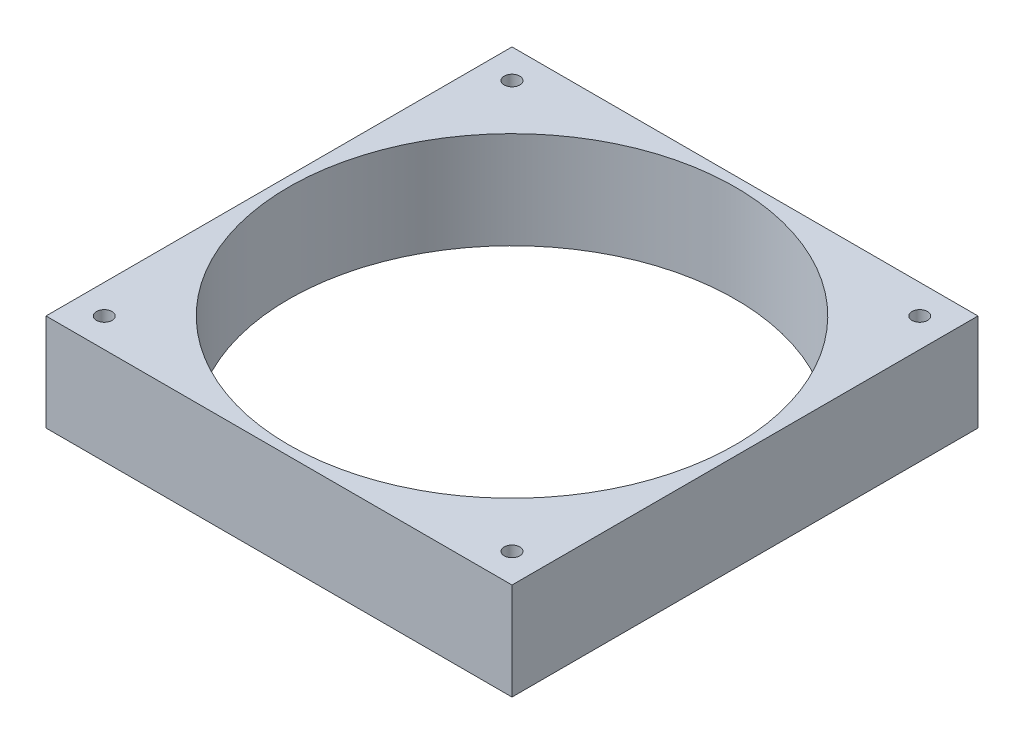
ISO-10303-21;
HEADER;
FILE_DESCRIPTION(('STEP AP214'),'2;1');
FILE_NAME('part.step','',(''),(''),'','','');
FILE_SCHEMA(('AUTOMOTIVE_DESIGN { 1 0 10303 214 1 1 1 1 }'));
ENDSEC;
DATA;
#1=APPLICATION_CONTEXT('core data for automotive mechanical design processes');
#2=APPLICATION_PROTOCOL_DEFINITION('international standard','automotive_design',2000,#1);
#3=PRODUCT_CONTEXT('',#1,'mechanical');
#4=PRODUCT('Part','Part','',(#3));
#5=PRODUCT_RELATED_PRODUCT_CATEGORY('part','',(#4));
#6=PRODUCT_DEFINITION_FORMATION('','',#4);
#7=PRODUCT_DEFINITION_CONTEXT('part definition',#1,'design');
#8=PRODUCT_DEFINITION('design','',#6,#7);
#9=PRODUCT_DEFINITION_SHAPE('','',#8);
#10=(LENGTH_UNIT() NAMED_UNIT(*) SI_UNIT(.MILLI.,.METRE.));
#11=(NAMED_UNIT(*) PLANE_ANGLE_UNIT() SI_UNIT($,.RADIAN.));
#12=(NAMED_UNIT(*) SI_UNIT($,.STERADIAN.) SOLID_ANGLE_UNIT());
#13=UNCERTAINTY_MEASURE_WITH_UNIT(LENGTH_MEASURE(1.E-05),#10,'distance_accuracy_value','');
#14=(GEOMETRIC_REPRESENTATION_CONTEXT(3) GLOBAL_UNCERTAINTY_ASSIGNED_CONTEXT((#13)) GLOBAL_UNIT_ASSIGNED_CONTEXT((#10,
#11,#12)) REPRESENTATION_CONTEXT('',''));
#15=CARTESIAN_POINT('',(0.,0.,0.));
#16=DIRECTION('',(0.,0.,1.));
#17=DIRECTION('',(1.,0.,0.));
#18=AXIS2_PLACEMENT_3D('',#15,#16,#17);
#19=CARTESIAN_POINT('',(0.,25.,0.));
#20=DIRECTION('',(1.,0.,0.));
#21=DIRECTION('',(0.,0.,-1.));
#22=AXIS2_PLACEMENT_3D('',#19,#20,#21);
#23=PLANE('',#22);
#24=DIRECTION('',(0.,0.,1.));
#25=VECTOR('',#24,1.);
#26=CARTESIAN_POINT('',(0.,0.,0.));
#27=LINE('',#26,#25);
#28=CARTESIAN_POINT('',(0.,0.,0.));
#29=VERTEX_POINT('',#28);
#30=CARTESIAN_POINT('',(0.,0.,120.));
#31=VERTEX_POINT('',#30);
#32=EDGE_CURVE('E98',#29,#31,#27,.T.);
#33=ORIENTED_EDGE('',*,*,#32,.T.);
#34=DIRECTION('',(0.,-1.,0.));
#35=VECTOR('',#34,1.);
#36=CARTESIAN_POINT('',(0.,25.,120.));
#37=LINE('',#36,#35);
#38=CARTESIAN_POINT('',(0.,25.,120.));
#39=VERTEX_POINT('',#38);
#40=EDGE_CURVE('E11',#39,#31,#37,.T.);
#41=ORIENTED_EDGE('',*,*,#40,.F.);
#42=DIRECTION('',(0.,0.,1.));
#43=VECTOR('',#42,1.);
#44=CARTESIAN_POINT('',(0.,25.,0.));
#45=LINE('',#44,#43);
#46=CARTESIAN_POINT('',(0.,25.,0.));
#47=VERTEX_POINT('',#46);
#48=EDGE_CURVE('E85',#47,#39,#45,.T.);
#49=ORIENTED_EDGE('',*,*,#48,.F.);
#50=DIRECTION('',(0.,-1.,0.));
#51=VECTOR('',#50,1.);
#52=CARTESIAN_POINT('',(0.,25.,0.));
#53=LINE('',#52,#51);
#54=EDGE_CURVE('E94',#47,#29,#53,.T.);
#55=ORIENTED_EDGE('',*,*,#54,.T.);
#56=EDGE_LOOP('',(#33,#41,#49,#55));
#57=FACE_BOUND('',#56,.T.);
#58=ADVANCED_FACE('F33',(#57),#23,.F.);
#59=CARTESIAN_POINT('',(0.,25.,120.));
#60=DIRECTION('',(0.,0.,-1.));
#61=DIRECTION('',(-1.,0.,0.));
#62=AXIS2_PLACEMENT_3D('',#59,#60,#61);
#63=PLANE('',#62);
#64=DIRECTION('',(1.,0.,0.));
#65=VECTOR('',#64,1.);
#66=CARTESIAN_POINT('',(0.,0.,120.));
#67=LINE('',#66,#65);
#68=CARTESIAN_POINT('',(120.,0.,120.));
#69=VERTEX_POINT('',#68);
#70=EDGE_CURVE('E89',#31,#69,#67,.T.);
#71=ORIENTED_EDGE('',*,*,#70,.T.);
#72=DIRECTION('',(0.,-1.,0.));
#73=VECTOR('',#72,1.);
#74=CARTESIAN_POINT('',(120.,25.,120.));
#75=LINE('',#74,#73);
#76=CARTESIAN_POINT('',(120.,25.,120.));
#77=VERTEX_POINT('',#76);
#78=EDGE_CURVE('E42',#77,#69,#75,.T.);
#79=ORIENTED_EDGE('',*,*,#78,.F.);
#80=DIRECTION('',(1.,0.,0.));
#81=VECTOR('',#80,1.);
#82=CARTESIAN_POINT('',(0.,25.,120.));
#83=LINE('',#82,#81);
#84=EDGE_CURVE('E80',#39,#77,#83,.T.);
#85=ORIENTED_EDGE('',*,*,#84,.F.);
#86=ORIENTED_EDGE('',*,*,#40,.T.);
#87=EDGE_LOOP('',(#71,#79,#85,#86));
#88=FACE_BOUND('',#87,.T.);
#89=ADVANCED_FACE('F88',(#88),#63,.F.);
#90=CARTESIAN_POINT('',(120.,25.,0.));
#91=DIRECTION('',(-1.,0.,0.));
#92=DIRECTION('',(0.,0.,1.));
#93=AXIS2_PLACEMENT_3D('',#90,#91,#92);
#94=PLANE('',#93);
#95=DIRECTION('',(0.,0.,-1.));
#96=VECTOR('',#95,1.);
#97=CARTESIAN_POINT('',(120.,0.,0.));
#98=LINE('',#97,#96);
#99=CARTESIAN_POINT('',(120.,0.,0.));
#100=VERTEX_POINT('',#99);
#101=EDGE_CURVE('E67',#69,#100,#98,.T.);
#102=ORIENTED_EDGE('',*,*,#101,.T.);
#103=DIRECTION('',(0.,-1.,0.));
#104=VECTOR('',#103,1.);
#105=CARTESIAN_POINT('',(120.,25.,0.));
#106=LINE('',#105,#104);
#107=CARTESIAN_POINT('',(120.,25.,0.));
#108=VERTEX_POINT('',#107);
#109=EDGE_CURVE('E90',#108,#100,#106,.T.);
#110=ORIENTED_EDGE('',*,*,#109,.F.);
#111=DIRECTION('',(0.,0.,-1.));
#112=VECTOR('',#111,1.);
#113=CARTESIAN_POINT('',(120.,25.,0.));
#114=LINE('',#113,#112);
#115=EDGE_CURVE('E83',#77,#108,#114,.T.);
#116=ORIENTED_EDGE('',*,*,#115,.F.);
#117=ORIENTED_EDGE('',*,*,#78,.T.);
#118=EDGE_LOOP('',(#102,#110,#116,#117));
#119=FACE_BOUND('',#118,.T.);
#120=ADVANCED_FACE('F92',(#119),#94,.F.);
#121=CARTESIAN_POINT('',(0.,25.,0.));
#122=DIRECTION('',(0.,0.,1.));
#123=DIRECTION('',(1.,0.,0.));
#124=AXIS2_PLACEMENT_3D('',#121,#122,#123);
#125=PLANE('',#124);
#126=DIRECTION('',(-1.,0.,0.));
#127=VECTOR('',#126,1.);
#128=CARTESIAN_POINT('',(0.,0.,0.));
#129=LINE('',#128,#127);
#130=EDGE_CURVE('E73',#100,#29,#129,.T.);
#131=ORIENTED_EDGE('',*,*,#130,.T.);
#132=ORIENTED_EDGE('',*,*,#54,.F.);
#133=DIRECTION('',(-1.,0.,0.));
#134=VECTOR('',#133,1.);
#135=CARTESIAN_POINT('',(0.,25.,0.));
#136=LINE('',#135,#134);
#137=EDGE_CURVE('E50',#108,#47,#136,.T.);
#138=ORIENTED_EDGE('',*,*,#137,.F.);
#139=ORIENTED_EDGE('',*,*,#109,.T.);
#140=EDGE_LOOP('',(#131,#132,#138,#139));
#141=FACE_BOUND('',#140,.T.);
#142=ADVANCED_FACE('F106',(#141),#125,.F.);
#143=CARTESIAN_POINT('',(0.,25.,0.));
#144=DIRECTION('',(0.,1.,0.));
#145=DIRECTION('',(0.,0.,1.));
#146=AXIS2_PLACEMENT_3D('',#143,#144,#145);
#147=PLANE('',#146);
#148=CARTESIAN_POINT('',(60.,25.,60.));
#149=DIRECTION('',(0.,1.,0.));
#150=DIRECTION('',(0.,0.,1.));
#151=AXIS2_PLACEMENT_3D('',#148,#149,#150);
#152=CIRCLE('',#151,57.5);
#153=CARTESIAN_POINT('',(60.,25.,117.5));
#154=VERTEX_POINT('',#153);
#155=EDGE_CURVE('E135',#154,#154,#152,.T.);
#156=ORIENTED_EDGE('',*,*,#155,.F.);
#157=EDGE_LOOP('',(#156));
#158=FACE_BOUND('',#157,.T.);
#159=CARTESIAN_POINT('',(112.5,25.,112.5));
#160=DIRECTION('',(0.,1.,0.));
#161=DIRECTION('',(0.,0.,1.));
#162=AXIS2_PLACEMENT_3D('',#159,#160,#161);
#163=CIRCLE('',#162,2.);
#164=CARTESIAN_POINT('',(112.5,25.,114.5));
#165=VERTEX_POINT('',#164);
#166=EDGE_CURVE('E130',#165,#165,#163,.T.);
#167=ORIENTED_EDGE('',*,*,#166,.F.);
#168=EDGE_LOOP('',(#167));
#169=FACE_BOUND('',#168,.T.);
#170=CARTESIAN_POINT('',(112.5,25.,7.49999999999999));
#171=DIRECTION('',(0.,1.,0.));
#172=DIRECTION('',(0.,0.,1.));
#173=AXIS2_PLACEMENT_3D('',#170,#171,#172);
#174=CIRCLE('',#173,2.);
#175=CARTESIAN_POINT('',(112.5,25.,9.49999999999999));
#176=VERTEX_POINT('',#175);
#177=EDGE_CURVE('E124',#176,#176,#174,.T.);
#178=ORIENTED_EDGE('',*,*,#177,.F.);
#179=EDGE_LOOP('',(#178));
#180=FACE_BOUND('',#179,.T.);
#181=CARTESIAN_POINT('',(7.49999999999963,25.,7.49999999999999));
#182=DIRECTION('',(0.,1.,0.));
#183=DIRECTION('',(0.,0.,1.));
#184=AXIS2_PLACEMENT_3D('',#181,#182,#183);
#185=CIRCLE('',#184,2.);
#186=CARTESIAN_POINT('',(7.49999999999963,25.,9.49999999999999));
#187=VERTEX_POINT('',#186);
#188=EDGE_CURVE('E118',#187,#187,#185,.T.);
#189=ORIENTED_EDGE('',*,*,#188,.F.);
#190=EDGE_LOOP('',(#189));
#191=FACE_BOUND('',#190,.T.);
#192=CARTESIAN_POINT('',(7.5,25.,112.5));
#193=DIRECTION('',(0.,1.,0.));
#194=DIRECTION('',(0.,0.,1.));
#195=AXIS2_PLACEMENT_3D('',#192,#193,#194);
#196=CIRCLE('',#195,2.);
#197=CARTESIAN_POINT('',(7.5,25.,114.5));
#198=VERTEX_POINT('',#197);
#199=EDGE_CURVE('E112',#198,#198,#196,.T.);
#200=ORIENTED_EDGE('',*,*,#199,.F.);
#201=EDGE_LOOP('',(#200));
#202=FACE_BOUND('',#201,.T.);
#203=ORIENTED_EDGE('',*,*,#48,.T.);
#204=ORIENTED_EDGE('',*,*,#84,.T.);
#205=ORIENTED_EDGE('',*,*,#115,.T.);
#206=ORIENTED_EDGE('',*,*,#137,.T.);
#207=EDGE_LOOP('',(#203,#204,#205,#206));
#208=FACE_BOUND('',#207,.T.);
#209=ADVANCED_FACE('F81',(#158,#169,#180,#191,#202,#208),#147,.T.);
#210=CARTESIAN_POINT('',(0.,0.,0.));
#211=DIRECTION('',(0.,1.,0.));
#212=DIRECTION('',(0.,0.,1.));
#213=AXIS2_PLACEMENT_3D('',#210,#211,#212);
#214=PLANE('',#213);
#215=CARTESIAN_POINT('',(60.,0.,60.));
#216=DIRECTION('',(0.,1.,0.));
#217=DIRECTION('',(0.,0.,1.));
#218=AXIS2_PLACEMENT_3D('',#215,#216,#217);
#219=CIRCLE('',#218,57.5);
#220=CARTESIAN_POINT('',(60.,0.,117.5));
#221=VERTEX_POINT('',#220);
#222=EDGE_CURVE('E36',#221,#221,#219,.T.);
#223=ORIENTED_EDGE('',*,*,#222,.T.);
#224=EDGE_LOOP('',(#223));
#225=FACE_BOUND('',#224,.T.);
#226=CARTESIAN_POINT('',(112.5,0.,112.5));
#227=DIRECTION('',(0.,1.,0.));
#228=DIRECTION('',(0.,0.,1.));
#229=AXIS2_PLACEMENT_3D('',#226,#227,#228);
#230=CIRCLE('',#229,2.);
#231=CARTESIAN_POINT('',(112.5,0.,114.5));
#232=VERTEX_POINT('',#231);
#233=EDGE_CURVE('E115',#232,#232,#230,.T.);
#234=ORIENTED_EDGE('',*,*,#233,.T.);
#235=EDGE_LOOP('',(#234));
#236=FACE_BOUND('',#235,.T.);
#237=CARTESIAN_POINT('',(112.5,0.,7.49999999999999));
#238=DIRECTION('',(0.,1.,0.));
#239=DIRECTION('',(0.,0.,1.));
#240=AXIS2_PLACEMENT_3D('',#237,#238,#239);
#241=CIRCLE('',#240,2.);
#242=CARTESIAN_POINT('',(112.5,0.,9.49999999999999));
#243=VERTEX_POINT('',#242);
#244=EDGE_CURVE('E127',#243,#243,#241,.T.);
#245=ORIENTED_EDGE('',*,*,#244,.T.);
#246=EDGE_LOOP('',(#245));
#247=FACE_BOUND('',#246,.T.);
#248=CARTESIAN_POINT('',(7.49999999999963,0.,7.49999999999999));
#249=DIRECTION('',(0.,1.,0.));
#250=DIRECTION('',(0.,0.,1.));
#251=AXIS2_PLACEMENT_3D('',#248,#249,#250);
#252=CIRCLE('',#251,2.);
#253=CARTESIAN_POINT('',(7.49999999999963,0.,9.49999999999999));
#254=VERTEX_POINT('',#253);
#255=EDGE_CURVE('E121',#254,#254,#252,.T.);
#256=ORIENTED_EDGE('',*,*,#255,.T.);
#257=EDGE_LOOP('',(#256));
#258=FACE_BOUND('',#257,.T.);
#259=CARTESIAN_POINT('',(7.5,0.,112.5));
#260=DIRECTION('',(0.,1.,0.));
#261=DIRECTION('',(0.,0.,1.));
#262=AXIS2_PLACEMENT_3D('',#259,#260,#261);
#263=CIRCLE('',#262,2.);
#264=CARTESIAN_POINT('',(7.5,0.,114.5));
#265=VERTEX_POINT('',#264);
#266=EDGE_CURVE('E101',#265,#265,#263,.T.);
#267=ORIENTED_EDGE('',*,*,#266,.T.);
#268=EDGE_LOOP('',(#267));
#269=FACE_BOUND('',#268,.T.);
#270=ORIENTED_EDGE('',*,*,#32,.F.);
#271=ORIENTED_EDGE('',*,*,#130,.F.);
#272=ORIENTED_EDGE('',*,*,#101,.F.);
#273=ORIENTED_EDGE('',*,*,#70,.F.);
#274=EDGE_LOOP('',(#270,#271,#272,#273));
#275=FACE_BOUND('',#274,.T.);
#276=ADVANCED_FACE('F109',(#225,#236,#247,#258,#269,#275),#214,.F.);
#277=CARTESIAN_POINT('',(7.5,0.,112.5));
#278=DIRECTION('',(0.,1.,0.));
#279=DIRECTION('',(0.,0.,1.));
#280=AXIS2_PLACEMENT_3D('',#277,#278,#279);
#281=CYLINDRICAL_SURFACE('',#280,2.);
#282=ORIENTED_EDGE('',*,*,#266,.F.);
#283=EDGE_LOOP('',(#282));
#284=FACE_BOUND('',#283,.T.);
#285=ORIENTED_EDGE('',*,*,#199,.T.);
#286=EDGE_LOOP('',(#285));
#287=FACE_BOUND('',#286,.T.);
#288=ADVANCED_FACE('F167',(#284,#287),#281,.F.);
#289=CARTESIAN_POINT('',(7.49999999999963,0.,7.49999999999999));
#290=DIRECTION('',(0.,1.,0.));
#291=DIRECTION('',(0.,0.,1.));
#292=AXIS2_PLACEMENT_3D('',#289,#290,#291);
#293=CYLINDRICAL_SURFACE('',#292,2.);
#294=ORIENTED_EDGE('',*,*,#255,.F.);
#295=EDGE_LOOP('',(#294));
#296=FACE_BOUND('',#295,.T.);
#297=ORIENTED_EDGE('',*,*,#188,.T.);
#298=EDGE_LOOP('',(#297));
#299=FACE_BOUND('',#298,.T.);
#300=ADVANCED_FACE('F173',(#296,#299),#293,.F.);
#301=CARTESIAN_POINT('',(112.5,0.,7.49999999999999));
#302=DIRECTION('',(0.,1.,0.));
#303=DIRECTION('',(0.,0.,1.));
#304=AXIS2_PLACEMENT_3D('',#301,#302,#303);
#305=CYLINDRICAL_SURFACE('',#304,2.);
#306=ORIENTED_EDGE('',*,*,#244,.F.);
#307=EDGE_LOOP('',(#306));
#308=FACE_BOUND('',#307,.T.);
#309=ORIENTED_EDGE('',*,*,#177,.T.);
#310=EDGE_LOOP('',(#309));
#311=FACE_BOUND('',#310,.T.);
#312=ADVANCED_FACE('F151',(#308,#311),#305,.F.);
#313=CARTESIAN_POINT('',(112.5,0.,112.5));
#314=DIRECTION('',(0.,1.,0.));
#315=DIRECTION('',(0.,0.,1.));
#316=AXIS2_PLACEMENT_3D('',#313,#314,#315);
#317=CYLINDRICAL_SURFACE('',#316,2.);
#318=ORIENTED_EDGE('',*,*,#233,.F.);
#319=EDGE_LOOP('',(#318));
#320=FACE_BOUND('',#319,.T.);
#321=ORIENTED_EDGE('',*,*,#166,.T.);
#322=EDGE_LOOP('',(#321));
#323=FACE_BOUND('',#322,.T.);
#324=ADVANCED_FACE('F146',(#320,#323),#317,.F.);
#325=CARTESIAN_POINT('',(60.,-75.,60.));
#326=DIRECTION('',(0.,1.,0.));
#327=DIRECTION('',(0.,0.,1.));
#328=AXIS2_PLACEMENT_3D('',#325,#326,#327);
#329=CYLINDRICAL_SURFACE('',#328,57.5);
#330=ORIENTED_EDGE('',*,*,#155,.T.);
#331=EDGE_LOOP('',(#330));
#332=FACE_BOUND('',#331,.T.);
#333=ORIENTED_EDGE('',*,*,#222,.F.);
#334=EDGE_LOOP('',(#333));
#335=FACE_BOUND('',#334,.T.);
#336=ADVANCED_FACE('F144',(#332,#335),#329,.F.);
#337=CLOSED_SHELL('',(#58,#89,#120,#142,#209,#276,#288,#300,#312,#324,#336));
#338=MANIFOLD_SOLID_BREP('B2',#337);
#339=ADVANCED_BREP_SHAPE_REPRESENTATION('',(#18,#338),#14);
#340=SHAPE_DEFINITION_REPRESENTATION(#9,#339);
ENDSEC;
END-ISO-10303-21;
